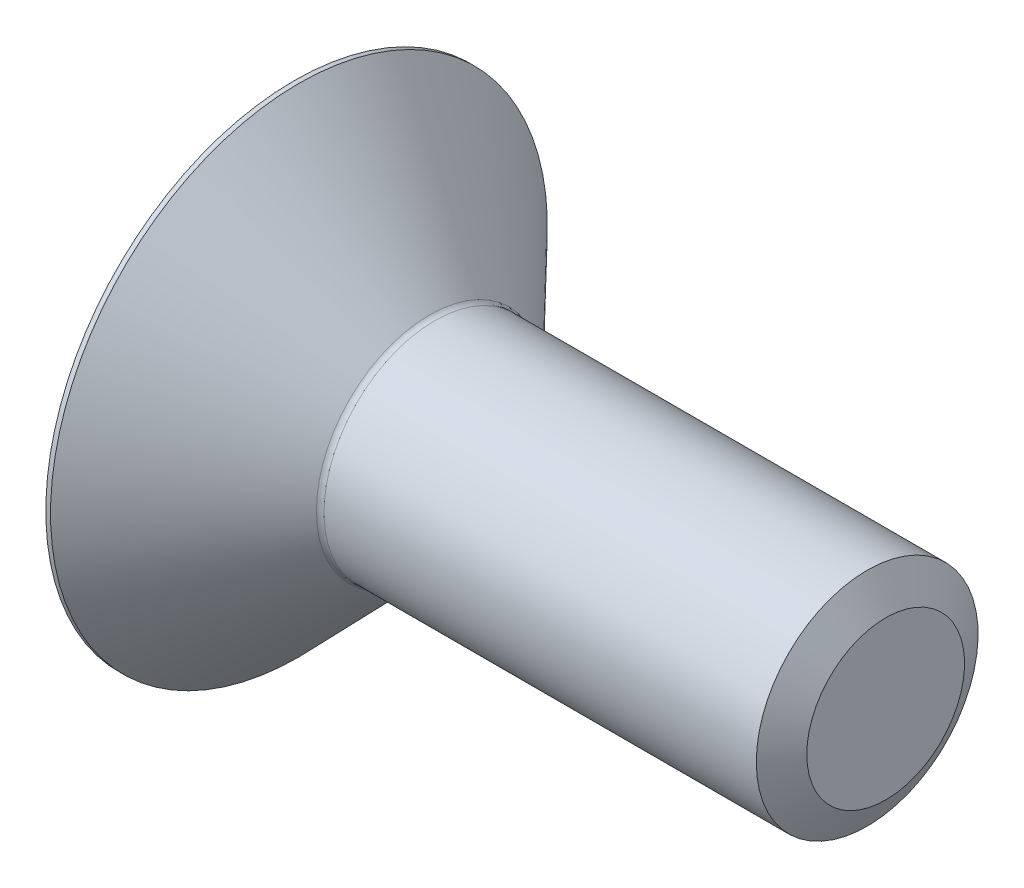
ISO-10303-21;
HEADER;
FILE_DESCRIPTION(('STEP AP214'),'2;1');
FILE_NAME('part.step','',(''),(''),'','','');
FILE_SCHEMA(('AUTOMOTIVE_DESIGN { 1 0 10303 214 1 1 1 1 }'));
ENDSEC;
DATA;
#1=APPLICATION_CONTEXT('core data for automotive mechanical design processes');
#2=APPLICATION_PROTOCOL_DEFINITION('international standard','automotive_design',2000,#1);
#3=PRODUCT_CONTEXT('',#1,'mechanical');
#4=PRODUCT('Part','Part','',(#3));
#5=PRODUCT_RELATED_PRODUCT_CATEGORY('part','',(#4));
#6=PRODUCT_DEFINITION_FORMATION('','',#4);
#7=PRODUCT_DEFINITION_CONTEXT('part definition',#1,'design');
#8=PRODUCT_DEFINITION('design','',#6,#7);
#9=PRODUCT_DEFINITION_SHAPE('','',#8);
#10=(LENGTH_UNIT() NAMED_UNIT(*) SI_UNIT(.MILLI.,.METRE.));
#11=(NAMED_UNIT(*) PLANE_ANGLE_UNIT() SI_UNIT($,.RADIAN.));
#12=(NAMED_UNIT(*) SI_UNIT($,.STERADIAN.) SOLID_ANGLE_UNIT());
#13=UNCERTAINTY_MEASURE_WITH_UNIT(LENGTH_MEASURE(1.E-05),#10,'distance_accuracy_value','');
#14=(GEOMETRIC_REPRESENTATION_CONTEXT(3) GLOBAL_UNCERTAINTY_ASSIGNED_CONTEXT((#13)) GLOBAL_UNIT_ASSIGNED_CONTEXT((#10,
#11,#12)) REPRESENTATION_CONTEXT('',''));
#15=CARTESIAN_POINT('',(0.,0.,0.));
#16=DIRECTION('',(0.,0.,1.));
#17=DIRECTION('',(1.,0.,0.));
#18=AXIS2_PLACEMENT_3D('',#15,#16,#17);
#19=CARTESIAN_POINT('',(0.,0.,0.));
#20=DIRECTION('',(1.,0.,0.));
#21=DIRECTION('',(0.,1.,0.));
#22=AXIS2_PLACEMENT_3D('',#19,#20,#21);
#23=CYLINDRICAL_SURFACE('',#22,1.5);
#24=CARTESIAN_POINT('',(-6.09755251837904,0.,0.));
#25=DIRECTION('',(1.,0.,0.));
#26=DIRECTION('',(0.,1.,0.));
#27=AXIS2_PLACEMENT_3D('',#24,#25,#26);
#28=CIRCLE('',#27,1.5);
#29=CARTESIAN_POINT('',(-6.09755251837904,1.5,0.));
#30=VERTEX_POINT('',#29);
#31=EDGE_CURVE('E123',#30,#30,#28,.T.);
#32=ORIENTED_EDGE('',*,*,#31,.T.);
#33=EDGE_LOOP('',(#32));
#34=FACE_BOUND('',#33,.T.);
#35=CARTESIAN_POINT('',(-0.25,0.,0.));
#36=DIRECTION('',(-1.,0.,0.));
#37=DIRECTION('',(0.,0.,1.));
#38=AXIS2_PLACEMENT_3D('',#35,#36,#37);
#39=CIRCLE('',#38,1.5);
#40=CARTESIAN_POINT('',(-0.25,0.,1.5));
#41=VERTEX_POINT('',#40);
#42=EDGE_CURVE('E114',#41,#41,#39,.T.);
#43=ORIENTED_EDGE('',*,*,#42,.T.);
#44=EDGE_LOOP('',(#43));
#45=FACE_BOUND('',#44,.T.);
#46=ADVANCED_FACE('F36',(#34,#45),#23,.T.);
#47=CARTESIAN_POINT('',(-8.,3.36,0.));
#48=DIRECTION('',(-1.,0.,0.));
#49=DIRECTION('',(0.,-1.,0.));
#50=AXIS2_PLACEMENT_3D('',#47,#48,#49);
#51=PLANE('',#50);
#52=CARTESIAN_POINT('',(-8.,0.,0.));
#53=DIRECTION('',(1.,0.,0.));
#54=DIRECTION('',(0.,1.,0.));
#55=AXIS2_PLACEMENT_3D('',#52,#53,#54);
#56=CIRCLE('',#55,3.36);
#57=CARTESIAN_POINT('',(-8.,3.36,0.));
#58=VERTEX_POINT('',#57);
#59=EDGE_CURVE('E206',#58,#58,#56,.T.);
#60=ORIENTED_EDGE('',*,*,#59,.F.);
#61=EDGE_LOOP('',(#60));
#62=FACE_BOUND('',#61,.T.);
#63=CARTESIAN_POINT('',(-8.,0.,0.));
#64=DIRECTION('',(-1.,0.,0.));
#65=DIRECTION('',(0.,-1.,0.));
#66=AXIS2_PLACEMENT_3D('',#63,#64,#65);
#67=CIRCLE('',#66,1.15470053837925);
#68=CARTESIAN_POINT('',(-8.,-0.577350269189631,0.999999999999996));
#69=VERTEX_POINT('',#68);
#70=CARTESIAN_POINT('',(-8.,-1.15470053837925,0.));
#71=VERTEX_POINT('',#70);
#72=EDGE_CURVE('E40',#69,#71,#67,.F.);
#73=ORIENTED_EDGE('',*,*,#72,.T.);
#74=CARTESIAN_POINT('',(-8.,-0.57735026918963,-0.999999999999997));
#75=VERTEX_POINT('',#74);
#76=EDGE_CURVE('E11',#71,#75,#67,.F.);
#77=ORIENTED_EDGE('',*,*,#76,.T.);
#78=CARTESIAN_POINT('',(-8.,0.577350269189625,-1.));
#79=VERTEX_POINT('',#78);
#80=EDGE_CURVE('E45',#75,#79,#67,.F.);
#81=ORIENTED_EDGE('',*,*,#80,.T.);
#82=CARTESIAN_POINT('',(-8.,1.15470053837925,0.));
#83=VERTEX_POINT('',#82);
#84=EDGE_CURVE('E110',#79,#83,#67,.F.);
#85=ORIENTED_EDGE('',*,*,#84,.T.);
#86=CARTESIAN_POINT('',(-8.,0.,0.));
#87=DIRECTION('',(-1.,0.,0.));
#88=DIRECTION('',(0.,0.,1.));
#89=AXIS2_PLACEMENT_3D('',#86,#87,#88);
#90=CIRCLE('',#89,1.15470053837925);
#91=CARTESIAN_POINT('',(-8.,0.577350269189629,0.999999999999997));
#92=VERTEX_POINT('',#91);
#93=EDGE_CURVE('E95',#92,#83,#90,.T.);
#94=ORIENTED_EDGE('',*,*,#93,.F.);
#95=EDGE_CURVE('E104',#92,#69,#67,.F.);
#96=ORIENTED_EDGE('',*,*,#95,.T.);
#97=EDGE_LOOP('',(#73,#77,#81,#85,#94,#96));
#98=FACE_BOUND('',#97,.T.);
#99=ADVANCED_FACE('F111',(#62,#98),#51,.T.);
#100=CARTESIAN_POINT('',(0.,0.,0.));
#101=DIRECTION('',(1.,0.,0.));
#102=DIRECTION('',(0.,1.,0.));
#103=AXIS2_PLACEMENT_3D('',#100,#101,#102);
#104=CYLINDRICAL_SURFACE('',#103,3.36);
#105=ORIENTED_EDGE('',*,*,#59,.T.);
#106=EDGE_LOOP('',(#105));
#107=FACE_BOUND('',#106,.T.);
#108=CARTESIAN_POINT('',(-7.93618112114115,0.,0.));
#109=DIRECTION('',(1.,0.,0.));
#110=DIRECTION('',(0.,1.,0.));
#111=AXIS2_PLACEMENT_3D('',#108,#109,#110);
#112=CIRCLE('',#111,3.36);
#113=CARTESIAN_POINT('',(-7.93618112114115,3.36,0.));
#114=VERTEX_POINT('',#113);
#115=EDGE_CURVE('E208',#114,#114,#112,.T.);
#116=ORIENTED_EDGE('',*,*,#115,.F.);
#117=EDGE_LOOP('',(#116));
#118=FACE_BOUND('',#117,.T.);
#119=ADVANCED_FACE('F196',(#107,#118),#104,.T.);
#120=CARTESIAN_POINT('',(-6.1694864984129,0.,0.));
#121=DIRECTION('',(-1.,0.,0.));
#122=DIRECTION('',(0.,-1.,0.));
#123=AXIS2_PLACEMENT_3D('',#120,#121,#122);
#124=CONICAL_SURFACE('',#123,1.5305341629541,0.802851455917393);
#125=ORIENTED_EDGE('',*,*,#115,.T.);
#126=EDGE_LOOP('',(#125));
#127=FACE_BOUND('',#126,.T.);
#128=CARTESIAN_POINT('',(-6.1694864984129,0.,0.));
#129=DIRECTION('',(1.,0.,0.));
#130=DIRECTION('',(0.,1.,0.));
#131=AXIS2_PLACEMENT_3D('',#128,#129,#130);
#132=CIRCLE('',#131,1.5305341629541);
#133=CARTESIAN_POINT('',(-6.1694864984129,1.5305341629541,0.));
#134=VERTEX_POINT('',#133);
#135=EDGE_CURVE('E212',#134,#134,#132,.T.);
#136=ORIENTED_EDGE('',*,*,#135,.F.);
#137=EDGE_LOOP('',(#136));
#138=FACE_BOUND('',#137,.T.);
#139=ADVANCED_FACE('F192',(#127,#138),#124,.T.);
#140=CARTESIAN_POINT('',(-6.09755251837904,0.,0.));
#141=DIRECTION('',(1.,0.,0.));
#142=DIRECTION('',(0.,1.,0.));
#143=AXIS2_PLACEMENT_3D('',#140,#141,#142);
#144=TOROIDAL_SURFACE('',#143,1.6,0.0999999999999999);
#145=ORIENTED_EDGE('',*,*,#135,.T.);
#146=EDGE_LOOP('',(#145));
#147=FACE_BOUND('',#146,.T.);
#148=ORIENTED_EDGE('',*,*,#31,.F.);
#149=EDGE_LOOP('',(#148));
#150=FACE_BOUND('',#149,.T.);
#151=ADVANCED_FACE('F188',(#147,#150),#144,.F.);
#152=CARTESIAN_POINT('',(-7.67,0.,0.));
#153=DIRECTION('',(-1.,0.,0.));
#154=DIRECTION('',(0.,0.,1.));
#155=AXIS2_PLACEMENT_3D('',#152,#153,#154);
#156=CONICAL_SURFACE('',#155,0.,1.2924281638629);
#157=CARTESIAN_POINT('',(-8.00003300494951,-0.577234799135789,1.0002));
#158=CARTESIAN_POINT('',(-7.99317677231321,-0.601209328784404,0.958674896561032));
#159=CARTESIAN_POINT('',(-7.986950249306,-0.625233209733957,0.917064314161421));
#160=CARTESIAN_POINT('',(-7.97600820198551,-0.673377505205147,0.83367594831071));
#161=CARTESIAN_POINT('',(-7.97129338172424,-0.697497959424798,0.791898096100636));
#162=CARTESIAN_POINT('',(-7.9636556441477,-0.745669161891495,0.70846312596663));
#163=CARTESIAN_POINT('',(-7.96072237456089,-0.769719488656233,0.66680673807147));
#164=CARTESIAN_POINT('',(-7.95678895886859,-0.817855017501818,0.58343355646172));
#165=CARTESIAN_POINT('',(-7.95578838324886,-0.841940210643129,0.54171677823086));
#166=CARTESIAN_POINT('',(-7.95578838324886,-0.890110596925751,0.458283221769139));
#167=CARTESIAN_POINT('',(-7.95678895886859,-0.914195790067062,0.416566443538279));
#168=CARTESIAN_POINT('',(-7.96072237456089,-0.962331318912646,0.333193261928529));
#169=CARTESIAN_POINT('',(-7.9636556441477,-0.986381645677384,0.29153687403337));
#170=CARTESIAN_POINT('',(-7.97129338172424,-1.03455284814408,0.208101903899363));
#171=CARTESIAN_POINT('',(-7.97600820198551,-1.05867330236373,0.166324051689289));
#172=CARTESIAN_POINT('',(-7.986950249306,-1.10681759783492,0.0829356858385784));
#173=CARTESIAN_POINT('',(-7.99317677231321,-1.13084147878448,0.0413251034389669));
#174=CARTESIAN_POINT('',(-8.00003300494951,-1.15481600843309,-0.000200000000000319));
#175=B_SPLINE_CURVE_WITH_KNOTS('',3,(#157,#158,#159,#160,#161,#162,#163,#164,#165,#166,#167,
#168,#169,#170,#171,#172,#173,#174),.UNSPECIFIED.,.F.,.F.,(4,2,2,2,2,2,2,2,4),(0.,
0.145319064827825,0.290705711767535,0.435239252261503,0.579740668498364,0.724242084735225,
0.868775625229193,1.0141622721689,1.15948133699673),.UNSPECIFIED.);
#176=EDGE_CURVE('E129',#69,#71,#175,.T.);
#177=ORIENTED_EDGE('',*,*,#176,.T.);
#178=ORIENTED_EDGE('',*,*,#72,.F.);
#179=EDGE_LOOP('',(#177,#178));
#180=FACE_BOUND('',#179,.T.);
#181=ADVANCED_FACE('F191',(#180),#156,.F.);
#182=CARTESIAN_POINT('',(-8.18642012479891,-1.50507658562174,1.));
#183=CARTESIAN_POINT('',(-8.17568053389836,-1.45995191683151,1.));
#184=CARTESIAN_POINT('',(-8.16507725550091,-1.41479478404147,1.));
#185=CARTESIAN_POINT('',(-8.14421246509078,-1.32439927872502,1.));
#186=CARTESIAN_POINT('',(-8.13395097066939,-1.27916090214299,1.));
#187=CARTESIAN_POINT('',(-8.10376110485824,-1.14320091952673,1.));
#188=CARTESIAN_POINT('',(-8.0844526928259,-1.0523395057026,1.));
#189=CARTESIAN_POINT('',(-8.0485427680109,-0.871021733651419,1.));
#190=CARTESIAN_POINT('',(-8.03191600726561,-0.780570478060274,1.));
#191=CARTESIAN_POINT('',(-8.00245938977244,-0.599053834032337,1.));
#192=CARTESIAN_POINT('',(-7.98962864404707,-0.507988594500085,1.));
#193=CARTESIAN_POINT('',(-7.96943375174607,-0.32401701013366,1.));
#194=CARTESIAN_POINT('',(-7.96214218519738,-0.231102062710143,1.));
#195=CARTESIAN_POINT('',(-7.95667782512395,-0.0915430747170626,1.));
#196=CARTESIAN_POINT('',(-7.9557682159605,-0.0450005144934817,1.));
#197=CARTESIAN_POINT('',(-7.95580922979905,0.048083890152762,1.));
#198=CARTESIAN_POINT('',(-7.9567598571057,0.0946257345735192,1.));
#199=CARTESIAN_POINT('',(-7.96235911230975,0.234573783926051,1.));
#200=CARTESIAN_POINT('',(-7.96977149970247,0.327875024932963,1.));
#201=CARTESIAN_POINT('',(-7.99036481799359,0.51386632785343,1.));
#202=CARTESIAN_POINT('',(-8.00355054731467,0.606555816131269,1.));
#203=CARTESIAN_POINT('',(-8.03433027338347,0.794559797027599,1.));
#204=CARTESIAN_POINT('',(-8.05206417336318,0.889850634542144,1.));
#205=CARTESIAN_POINT('',(-8.09017928884159,1.07990716554416,1.));
#206=CARTESIAN_POINT('',(-8.11056098996145,1.17467275936659,1.));
#207=CARTESIAN_POINT('',(-8.15303020702755,1.36384761434311,1.));
#208=CARTESIAN_POINT('',(-8.17511824931274,1.45825675605088,1.));
#209=CARTESIAN_POINT('',(-8.22042048843015,1.64680497415504,1.));
#210=CARTESIAN_POINT('',(-8.24363471263919,1.74094404392717,1.));
#211=CARTESIAN_POINT('',(-8.29049807328423,1.92768913293957,1.));
#212=CARTESIAN_POINT('',(-8.31413631318398,2.02029789764918,1.));
#213=CARTESIAN_POINT('',(-8.36194659114886,2.20537976707471,1.));
#214=CARTESIAN_POINT('',(-8.38611864310246,2.2978528681941,1.));
#215=CARTESIAN_POINT('',(-8.43481362957481,2.48255351818147,1.));
#216=CARTESIAN_POINT('',(-8.45933596375947,2.57478122564271,1.));
#217=CARTESIAN_POINT('',(-8.5086763218414,2.75915354563859,1.));
#218=CARTESIAN_POINT('',(-8.53349433367616,2.8512981613992,1.));
#219=CARTESIAN_POINT('',(-8.55841535287488,2.94341459729474,1.));
#220=B_SPLINE_CURVE_WITH_KNOTS('',3,(#182,#183,#184,#185,#186,#187,#188,#189,#190,#191,#192,
#193,#194,#195,#196,#197,#198,#199,#200,#201,#202,#203,#204,#205,#206,#207,#208,#209,#210,#211,
#212,#213,#214,#215,#216,#217,#218,#219),.UNSPECIFIED.,.F.,.F.,(4,2,2,2,2,2,2,2,2,2,2,2,2,2,2,2,
2,2,4),(0.,0.139154753232827,0.278316657587892,0.556964604480121,0.83281288176632,
1.10859650773445,1.38793420964474,1.52755398880046,1.66717409104072,1.94769382621527,
2.22844715485888,2.519169414303,2.80994506926728,3.10081077796332,3.39168356097394,
3.67841536084619,3.96515462957441,4.25145053495921,4.53773480030589),.UNSPECIFIED.);
#221=EDGE_CURVE('E100',#92,#69,#220,.F.);
#222=ORIENTED_EDGE('',*,*,#221,.T.);
#223=ORIENTED_EDGE('',*,*,#95,.F.);
#224=EDGE_LOOP('',(#222,#223));
#225=FACE_BOUND('',#224,.T.);
#226=ADVANCED_FACE('F105',(#225),#156,.F.);
#227=CARTESIAN_POINT('',(-8.0000330049495,1.15481600843309,-0.000199999999999794));
#228=CARTESIAN_POINT('',(-7.99317677231321,1.13084147878447,0.0413251034389675));
#229=CARTESIAN_POINT('',(-7.986950249306,1.10681759783492,0.0829356858385789));
#230=CARTESIAN_POINT('',(-7.97600820198551,1.05867330236373,0.166324051689289));
#231=CARTESIAN_POINT('',(-7.97129338172424,1.03455284814408,0.208101903899364));
#232=CARTESIAN_POINT('',(-7.9636556441477,0.986381645677383,0.29153687403337));
#233=CARTESIAN_POINT('',(-7.96072237456089,0.962331318912645,0.33319326192853));
#234=CARTESIAN_POINT('',(-7.95678895886859,0.91419579006706,0.416566443538279));
#235=CARTESIAN_POINT('',(-7.95578838324886,0.890110596925749,0.458283221769139));
#236=CARTESIAN_POINT('',(-7.95578838324886,0.841940210643127,0.54171677823086));
#237=CARTESIAN_POINT('',(-7.95678895886859,0.817855017501816,0.58343355646172));
#238=CARTESIAN_POINT('',(-7.96072237456089,0.769719488656231,0.66680673807147));
#239=CARTESIAN_POINT('',(-7.9636556441477,0.745669161891493,0.70846312596663));
#240=CARTESIAN_POINT('',(-7.97129338172424,0.697497959424797,0.791898096100636));
#241=CARTESIAN_POINT('',(-7.97600820198551,0.673377505205146,0.83367594831071));
#242=CARTESIAN_POINT('',(-7.986950249306,0.625233209733955,0.917064314161421));
#243=CARTESIAN_POINT('',(-7.99317677231321,0.601209328784402,0.958674896561032));
#244=CARTESIAN_POINT('',(-8.0000330049495,0.577234799135788,1.0002));
#245=B_SPLINE_CURVE_WITH_KNOTS('',3,(#227,#228,#229,#230,#231,#232,#233,#234,#235,#236,#237,
#238,#239,#240,#241,#242,#243,#244),.UNSPECIFIED.,.F.,.F.,(4,2,2,2,2,2,2,2,4),(0.,
0.145319064827825,0.290705711767534,0.435239252261502,0.579740668498363,0.724242084735224,
0.868775625229192,1.0141622721689,1.15948133699673),.UNSPECIFIED.);
#246=EDGE_CURVE('E91',#83,#92,#245,.T.);
#247=ORIENTED_EDGE('',*,*,#246,.T.);
#248=ORIENTED_EDGE('',*,*,#93,.T.);
#249=EDGE_LOOP('',(#247,#248));
#250=FACE_BOUND('',#249,.T.);
#251=ADVANCED_FACE('F93',(#250),#156,.F.);
#252=CARTESIAN_POINT('',(-8.00003300494951,0.577234799135787,-1.0002));
#253=CARTESIAN_POINT('',(-7.99317677231321,0.601209328784402,-0.958674896561033));
#254=CARTESIAN_POINT('',(-7.986950249306,0.625233209733955,-0.917064314161421));
#255=CARTESIAN_POINT('',(-7.97600820198551,0.673377505205145,-0.833675948310711));
#256=CARTESIAN_POINT('',(-7.97129338172424,0.697497959424796,-0.791898096100636));
#257=CARTESIAN_POINT('',(-7.9636556441477,0.745669161891493,-0.70846312596663));
#258=CARTESIAN_POINT('',(-7.96072237456089,0.769719488656231,-0.66680673807147));
#259=CARTESIAN_POINT('',(-7.95678895886859,0.817855017501816,-0.583433556461721));
#260=CARTESIAN_POINT('',(-7.95578838324886,0.841940210643127,-0.54171677823086));
#261=CARTESIAN_POINT('',(-7.95578838324886,0.890110596925749,-0.458283221769139));
#262=CARTESIAN_POINT('',(-7.95678895886859,0.91419579006706,-0.416566443538279));
#263=CARTESIAN_POINT('',(-7.96072237456089,0.962331318912645,-0.33319326192853));
#264=CARTESIAN_POINT('',(-7.9636556441477,0.986381645677383,-0.29153687403337));
#265=CARTESIAN_POINT('',(-7.97129338172424,1.03455284814408,-0.208101903899364));
#266=CARTESIAN_POINT('',(-7.97600820198551,1.05867330236373,-0.166324051689289));
#267=CARTESIAN_POINT('',(-7.986950249306,1.10681759783492,-0.0829356858385788));
#268=CARTESIAN_POINT('',(-7.99317677231321,1.13084147878447,-0.0413251034389674));
#269=CARTESIAN_POINT('',(-8.0000330049495,1.15481600843309,0.000200000000000013));
#270=B_SPLINE_CURVE_WITH_KNOTS('',3,(#252,#253,#254,#255,#256,#257,#258,#259,#260,#261,#262,
#263,#264,#265,#266,#267,#268,#269),.UNSPECIFIED.,.F.,.F.,(4,2,2,2,2,2,2,2,4),(0.,
0.145319064827825,0.290705711767534,0.435239252261502,0.579740668498364,0.724242084735225,
0.868775625229193,1.0141622721689,1.15948133699673),.UNSPECIFIED.);
#271=EDGE_CURVE('E113',#79,#83,#270,.T.);
#272=ORIENTED_EDGE('',*,*,#271,.T.);
#273=ORIENTED_EDGE('',*,*,#84,.F.);
#274=EDGE_LOOP('',(#272,#273));
#275=FACE_BOUND('',#274,.T.);
#276=ADVANCED_FACE('F282',(#275),#156,.F.);
#277=CARTESIAN_POINT('',(-8.18642012479891,-1.50507658562174,-1.));
#278=CARTESIAN_POINT('',(-8.17568053389836,-1.45995191683151,-1.));
#279=CARTESIAN_POINT('',(-8.16507725550091,-1.41479478404147,-1.));
#280=CARTESIAN_POINT('',(-8.14421246509078,-1.32439927872502,-1.));
#281=CARTESIAN_POINT('',(-8.13395097066939,-1.27916090214299,-1.));
#282=CARTESIAN_POINT('',(-8.10376110485824,-1.14320091952673,-1.));
#283=CARTESIAN_POINT('',(-8.0844526928259,-1.0523395057026,-1.));
#284=CARTESIAN_POINT('',(-8.0485427680109,-0.871021733651419,-1.));
#285=CARTESIAN_POINT('',(-8.03191600726561,-0.780570478060274,-1.));
#286=CARTESIAN_POINT('',(-8.00245938977244,-0.599053834032336,-1.));
#287=CARTESIAN_POINT('',(-7.98962864404707,-0.507988594500085,-1.));
#288=CARTESIAN_POINT('',(-7.96943375174607,-0.32401701013366,-1.));
#289=CARTESIAN_POINT('',(-7.96214218519738,-0.231102062710143,-1.));
#290=CARTESIAN_POINT('',(-7.95667782512395,-0.0915430747170623,-1.));
#291=CARTESIAN_POINT('',(-7.9557682159605,-0.0450005144934814,-1.));
#292=CARTESIAN_POINT('',(-7.95580922979905,0.0480838901527623,-1.));
#293=CARTESIAN_POINT('',(-7.9567598571057,0.0946257345735195,-1.));
#294=CARTESIAN_POINT('',(-7.96235911230975,0.234573783926051,-1.));
#295=CARTESIAN_POINT('',(-7.96977149970247,0.327875024932963,-1.));
#296=CARTESIAN_POINT('',(-7.99036481799359,0.513866327853431,-1.));
#297=CARTESIAN_POINT('',(-8.00355054731467,0.60655581613127,-1.));
#298=CARTESIAN_POINT('',(-8.03433027338347,0.794559797027599,-1.));
#299=CARTESIAN_POINT('',(-8.05206417336318,0.889850634542144,-1.));
#300=CARTESIAN_POINT('',(-8.09017928884159,1.07990716554416,-1.));
#301=CARTESIAN_POINT('',(-8.11056098996145,1.17467275936659,-1.));
#302=CARTESIAN_POINT('',(-8.15303020702755,1.36384761434311,-1.));
#303=CARTESIAN_POINT('',(-8.17511824931274,1.45825675605088,-1.));
#304=CARTESIAN_POINT('',(-8.22042048843015,1.64680497415504,-1.));
#305=CARTESIAN_POINT('',(-8.24363471263919,1.74094404392717,-1.));
#306=CARTESIAN_POINT('',(-8.29049807328423,1.92768913293957,-1.));
#307=CARTESIAN_POINT('',(-8.31413631318398,2.02029789764918,-1.));
#308=CARTESIAN_POINT('',(-8.36194659114886,2.20537976707471,-1.));
#309=CARTESIAN_POINT('',(-8.38611864310246,2.2978528681941,-1.));
#310=CARTESIAN_POINT('',(-8.43481362957481,2.48255351818147,-1.));
#311=CARTESIAN_POINT('',(-8.45933596375947,2.57478122564271,-1.));
#312=CARTESIAN_POINT('',(-8.5086763218414,2.75915354563859,-1.));
#313=CARTESIAN_POINT('',(-8.53349433367616,2.8512981613992,-1.));
#314=CARTESIAN_POINT('',(-8.55841535287488,2.94341459729474,-1.));
#315=B_SPLINE_CURVE_WITH_KNOTS('',3,(#277,#278,#279,#280,#281,#282,#283,#284,#285,#286,#287,
#288,#289,#290,#291,#292,#293,#294,#295,#296,#297,#298,#299,#300,#301,#302,#303,#304,#305,#306,
#307,#308,#309,#310,#311,#312,#313,#314),.UNSPECIFIED.,.F.,.F.,(4,2,2,2,2,2,2,2,2,2,2,2,2,2,2,2,
2,2,4),(0.,0.139154753232827,0.278316657587892,0.556964604480121,0.83281288176632,
1.10859650773445,1.38793420964474,1.52755398880046,1.66717409104072,1.94769382621527,
2.22844715485888,2.519169414303,2.80994506926728,3.10081077796332,3.39168356097394,
3.67841536084619,3.96515462957441,4.25145053495921,4.53773480030589),.UNSPECIFIED.);
#316=EDGE_CURVE('E241',#75,#79,#315,.T.);
#317=ORIENTED_EDGE('',*,*,#316,.T.);
#318=ORIENTED_EDGE('',*,*,#80,.F.);
#319=EDGE_LOOP('',(#317,#318));
#320=FACE_BOUND('',#319,.T.);
#321=ADVANCED_FACE('F269',(#320),#156,.F.);
#322=CARTESIAN_POINT('',(-8.00003300494951,-1.15481600843309,0.000199999999999856));
#323=CARTESIAN_POINT('',(-7.99317677231321,-1.13084147878448,-0.0413251034389674));
#324=CARTESIAN_POINT('',(-7.986950249306,-1.10681759783492,-0.0829356858385789));
#325=CARTESIAN_POINT('',(-7.97600820198551,-1.05867330236373,-0.16632405168929));
#326=CARTESIAN_POINT('',(-7.97129338172424,-1.03455284814408,-0.208101903899364));
#327=CARTESIAN_POINT('',(-7.9636556441477,-0.986381645677385,-0.29153687403337));
#328=CARTESIAN_POINT('',(-7.96072237456089,-0.962331318912646,-0.33319326192853));
#329=CARTESIAN_POINT('',(-7.95678895886859,-0.914195790067062,-0.416566443538279));
#330=CARTESIAN_POINT('',(-7.95578838324886,-0.890110596925751,-0.45828322176914));
#331=CARTESIAN_POINT('',(-7.95578838324886,-0.841940210643129,-0.54171677823086));
#332=CARTESIAN_POINT('',(-7.95678895886859,-0.817855017501818,-0.58343355646172));
#333=CARTESIAN_POINT('',(-7.96072237456089,-0.769719488656233,-0.66680673807147));
#334=CARTESIAN_POINT('',(-7.9636556441477,-0.745669161891495,-0.70846312596663));
#335=CARTESIAN_POINT('',(-7.97129338172424,-0.697497959424798,-0.791898096100636));
#336=CARTESIAN_POINT('',(-7.97600820198551,-0.673377505205147,-0.83367594831071));
#337=CARTESIAN_POINT('',(-7.986950249306,-0.625233209733956,-0.917064314161421));
#338=CARTESIAN_POINT('',(-7.99317677231321,-0.601209328784404,-0.958674896561032));
#339=CARTESIAN_POINT('',(-8.00003300494951,-0.577234799135789,-1.0002));
#340=B_SPLINE_CURVE_WITH_KNOTS('',3,(#322,#323,#324,#325,#326,#327,#328,#329,#330,#331,#332,
#333,#334,#335,#336,#337,#338,#339),.UNSPECIFIED.,.F.,.F.,(4,2,2,2,2,2,2,2,4),(0.,
0.145319064827825,0.290705711767534,0.435239252261502,0.579740668498364,0.724242084735225,
0.868775625229193,1.0141622721689,1.15948133699673),.UNSPECIFIED.);
#341=EDGE_CURVE('E131',#71,#75,#340,.T.);
#342=ORIENTED_EDGE('',*,*,#341,.T.);
#343=ORIENTED_EDGE('',*,*,#76,.F.);
#344=EDGE_LOOP('',(#342,#343));
#345=FACE_BOUND('',#344,.T.);
#346=ADVANCED_FACE('F272',(#345),#156,.F.);
#347=CARTESIAN_POINT('',(-6.9,0.,0.));
#348=DIRECTION('',(-1.,0.,0.));
#349=DIRECTION('',(0.,0.,1.));
#350=AXIS2_PLACEMENT_3D('',#347,#348,#349);
#351=CONICAL_SURFACE('',#350,1.15470053837925,1.0471975511966);
#352=CARTESIAN_POINT('',(-6.23333333333334,0.,0.));
#353=VERTEX_POINT('',#352);
#354=VERTEX_LOOP('',#353);
#355=FACE_BOUND('',#354,.T.);
#356=CARTESIAN_POINT('',(-7.27183528873947,-1.49514512143374,1.));
#357=CARTESIAN_POINT('',(-7.25111502079343,-1.4519612611533,1.));
#358=CARTESIAN_POINT('',(-7.23061367234947,-1.40867282404236,1.));
#359=CARTESIAN_POINT('',(-7.1901634335246,-1.32182947914248,1.));
#360=CARTESIAN_POINT('',(-7.17021464256729,-1.27827452509756,1.));
#361=CARTESIAN_POINT('',(-7.11114515483648,-1.14662339890625,1.));
#362=CARTESIAN_POINT('',(-7.07305252653304,-1.05805724149108,1.));
#363=CARTESIAN_POINT('',(-7.00024582070057,-0.876833003172497,1.));
#364=CARTESIAN_POINT('',(-6.96564584045392,-0.784128452056495,1.));
#365=CARTESIAN_POINT('',(-6.90407347381845,-0.596331746532131,1.));
#366=CARTESIAN_POINT('',(-6.87708128484786,-0.501246505541257,1.));
#367=CARTESIAN_POINT('',(-6.84577577003502,-0.356699986452703,1.));
#368=CARTESIAN_POINT('',(-6.83687509854699,-0.30824416317171,1.));
#369=CARTESIAN_POINT('',(-6.82274243175691,-0.210788870695443,1.));
#370=CARTESIAN_POINT('',(-6.81751018853518,-0.161789438465742,1.));
#371=CARTESIAN_POINT('',(-6.81119898098177,-0.064106048997066,1.));
#372=CARTESIAN_POINT('',(-6.81007100501111,-0.0154253461269769,1.));
#373=CARTESIAN_POINT('',(-6.81193297830514,0.0818553564032755,1.));
#374=CARTESIAN_POINT('',(-6.81492318255361,0.130455350879702,1.));
#375=CARTESIAN_POINT('',(-6.8271183217293,0.250369589613778,1.));
#376=CARTESIAN_POINT('',(-6.83860856098489,0.321451919115027,1.));
#377=CARTESIAN_POINT('',(-6.86824031739763,0.462229038490168,1.));
#378=CARTESIAN_POINT('',(-6.88638985094493,0.531922048861732,1.));
#379=CARTESIAN_POINT('',(-6.92786972268665,0.671415729806805,1.));
#380=CARTESIAN_POINT('',(-6.95130716830693,0.74118372941807,1.));
#381=CARTESIAN_POINT('',(-7.00156448824641,0.879438319396288,1.));
#382=CARTESIAN_POINT('',(-7.02838317523047,0.94792534993256,1.));
#383=CARTESIAN_POINT('',(-7.10005391547339,1.12214515906645,1.));
#384=CARTESIAN_POINT('',(-7.14657230519898,1.22718574040678,1.));
#385=CARTESIAN_POINT('',(-7.24287692224798,1.43575968104558,1.));
#386=CARTESIAN_POINT('',(-7.29266398782224,1.53929264533347,1.));
#387=CARTESIAN_POINT('',(-7.39433644453464,1.74546702338822,1.));
#388=CARTESIAN_POINT('',(-7.44622418186697,1.84810727553999,1.));
#389=CARTESIAN_POINT('',(-7.55133836883522,2.05270058021726,1.));
#390=CARTESIAN_POINT('',(-7.60456486267233,2.15465360991172,1.));
#391=CARTESIAN_POINT('',(-7.7068669169112,2.34846553091283,1.));
#392=CARTESIAN_POINT('',(-7.75585965896403,2.44036823161571,1.));
#393=CARTESIAN_POINT('',(-7.85440313282821,2.623877990053,1.));
#394=CARTESIAN_POINT('',(-7.90395388528948,2.71548503668387,1.));
#395=CARTESIAN_POINT('',(-8.00334710767982,2.89823865557593,1.));
#396=CARTESIAN_POINT('',(-8.05318851504101,2.98938580641155,1.));
#397=CARTESIAN_POINT('',(-8.15319572337612,3.17149583112621,1.));
#398=CARTESIAN_POINT('',(-8.20336150723714,3.26245871439934,1.));
#399=CARTESIAN_POINT('',(-8.25364621220496,3.35335539208175,1.));
#400=B_SPLINE_CURVE_WITH_KNOTS('',3,(#356,#357,#358,#359,#360,#361,#362,#363,#364,#365,#366,
#367,#368,#369,#370,#371,#372,#373,#374,#375,#376,#377,#378,#379,#380,#381,#382,#383,#384,#385,
#386,#387,#388,#389,#390,#391,#392,#393,#394,#395,#396,#397,#398,#399),.UNSPECIFIED.,.F.,.F.,(4,
2,2,2,2,2,2,2,2,2,2,2,2,2,2,2,2,2,2,2,2,4),(0.,0.14369034182065,0.287406372566272,
0.576560332877491,0.87325948893403,1.16917907000006,1.31686338831957,1.46453772487642,
1.61044269221659,1.75635669390452,1.97192533331897,2.18775432802313,2.40842600301165,
2.62902040304935,2.97355048126458,3.31816926186283,3.6631841739513,4.00821049225242,
4.32064609598596,4.63309330006987,4.9447457824876,5.2563819552864),.UNSPECIFIED.);
#401=CARTESIAN_POINT('',(-6.9,-0.577350269189627,1.));
#402=VERTEX_POINT('',#401);
#403=CARTESIAN_POINT('',(-6.9,0.577350269189625,1.));
#404=VERTEX_POINT('',#403);
#405=EDGE_CURVE('E160',#402,#404,#400,.T.);
#406=ORIENTED_EDGE('',*,*,#405,.T.);
#407=CARTESIAN_POINT('',(-6.90006667666567,0.577234799135787,1.0002));
#408=CARTESIAN_POINT('',(-6.88540897364915,0.602607795820547,0.95625268060172));
#409=CARTESIAN_POINT('',(-6.8720777236209,0.628199807531657,0.911926016050179));
#410=CARTESIAN_POINT('',(-6.84880650762345,0.67982709833083,0.822504925328878));
#411=CARTESIAN_POINT('',(-6.83887477654978,0.705863295614157,0.777408908798269));
#412=CARTESIAN_POINT('',(-6.82341269488208,0.757612978088367,0.687775829477381));
#413=CARTESIAN_POINT('',(-6.81777946809895,0.783318495222182,0.643252567766781));
#414=CARTESIAN_POINT('',(-6.81105128864025,0.83485064837367,0.553996260284983));
#415=CARTESIAN_POINT('',(-6.80995076792166,0.86067709674978,0.509263539518505));
#416=CARTESIAN_POINT('',(-6.81222505229814,0.908946264126689,0.425658889182653));
#417=CARTESIAN_POINT('',(-6.81504143886341,0.931396163287556,0.386774523211233));
#418=CARTESIAN_POINT('',(-6.82397245021735,0.976149681982092,0.309259155014813));
#419=CARTESIAN_POINT('',(-6.8300901337543,0.99845314641145,0.270628421438361));
#420=CARTESIAN_POINT('',(-6.84538572572582,1.04329913914046,0.192952883515855));
#421=CARTESIAN_POINT('',(-6.85462855216896,1.0658359836813,0.153917923728832));
#422=CARTESIAN_POINT('',(-6.87560684575553,1.11057330008463,0.0764306187239879));
#423=CARTESIAN_POINT('',(-6.88733737513366,1.13277434629517,0.0379772787061408));
#424=CARTESIAN_POINT('',(-6.90006667666567,1.15481600843309,-0.000199999999999794));
#425=B_SPLINE_CURVE_WITH_KNOTS('',3,(#407,#408,#409,#410,#411,#412,#413,#414,#415,#416,#417,
#418,#419,#420,#421,#422,#423,#424),.UNSPECIFIED.,.F.,.F.,(4,2,2,2,2,2,2,2,4),(0.,
0.158523820030115,0.317428970089342,0.472400167924633,0.627180939971648,0.762016584872711,
0.896977373984233,1.03493410168667,1.17261952416172),.UNSPECIFIED.);
#426=CARTESIAN_POINT('',(-6.9,1.15470053837925,0.));
#427=VERTEX_POINT('',#426);
#428=EDGE_CURVE('E120',#404,#427,#425,.T.);
#429=ORIENTED_EDGE('',*,*,#428,.T.);
#430=CARTESIAN_POINT('',(-6.90006667666567,1.15481600843309,0.000200000000000205));
#431=CARTESIAN_POINT('',(-6.88540897364915,1.12944301174833,-0.0437473193982798));
#432=CARTESIAN_POINT('',(-6.8720777236209,1.10385100003722,-0.0880739839498201));
#433=CARTESIAN_POINT('',(-6.84880650762345,1.05222370923805,-0.177495074671122));
#434=CARTESIAN_POINT('',(-6.83887477654978,1.02618751195472,-0.222591091201731));
#435=CARTESIAN_POINT('',(-6.82341269488208,0.974437829480509,-0.312224170522618));
#436=CARTESIAN_POINT('',(-6.81777946809895,0.948732312346694,-0.356747432233219));
#437=CARTESIAN_POINT('',(-6.81105128864025,0.897200159195206,-0.446003739715017));
#438=CARTESIAN_POINT('',(-6.80995076792166,0.871373710819096,-0.490736460481494));
#439=CARTESIAN_POINT('',(-6.81222505229814,0.823104543442187,-0.574341110817346));
#440=CARTESIAN_POINT('',(-6.81504143886341,0.80065464428132,-0.613225476788766));
#441=CARTESIAN_POINT('',(-6.82397245021735,0.755901125586784,-0.690740844985186));
#442=CARTESIAN_POINT('',(-6.8300901337543,0.733597661157426,-0.729371578561639));
#443=CARTESIAN_POINT('',(-6.84538572572582,0.688751668428419,-0.807047116484145));
#444=CARTESIAN_POINT('',(-6.85462855216896,0.666214823887575,-0.846082076271167));
#445=CARTESIAN_POINT('',(-6.87560684575553,0.621477507484249,-0.923569381276012));
#446=CARTESIAN_POINT('',(-6.88733737513366,0.599276461273705,-0.962022721293859));
#447=CARTESIAN_POINT('',(-6.90006667666567,0.577234799135787,-1.0002));
#448=B_SPLINE_CURVE_WITH_KNOTS('',3,(#430,#431,#432,#433,#434,#435,#436,#437,#438,#439,#440,
#441,#442,#443,#444,#445,#446,#447),.UNSPECIFIED.,.F.,.F.,(4,2,2,2,2,2,2,2,4),(0.,
0.158523820030115,0.317428970089342,0.472400167924633,0.627180939971648,0.762016584872711,
0.896977373984233,1.03493410168667,1.17261952416172),.UNSPECIFIED.);
#449=CARTESIAN_POINT('',(-6.9,0.577350269189626,-0.999999999999999));
#450=VERTEX_POINT('',#449);
#451=EDGE_CURVE('E207',#427,#450,#448,.T.);
#452=ORIENTED_EDGE('',*,*,#451,.T.);
#453=CARTESIAN_POINT('',(-7.27183528873947,-1.49514512143373,-1.));
#454=CARTESIAN_POINT('',(-7.25111502079343,-1.4519612611533,-1.));
#455=CARTESIAN_POINT('',(-7.23061367234947,-1.40867282404236,-1.));
#456=CARTESIAN_POINT('',(-7.1901634335246,-1.32182947914247,-1.));
#457=CARTESIAN_POINT('',(-7.17021464256729,-1.27827452509756,-1.));
#458=CARTESIAN_POINT('',(-7.11114515483648,-1.14662339890625,-1.));
#459=CARTESIAN_POINT('',(-7.07305252653304,-1.05805724149108,-1.));
#460=CARTESIAN_POINT('',(-7.00024582070057,-0.876833003172495,-1.));
#461=CARTESIAN_POINT('',(-6.96564584045392,-0.784128452056494,-1.));
#462=CARTESIAN_POINT('',(-6.90407347381845,-0.59633174653213,-1.));
#463=CARTESIAN_POINT('',(-6.87708128484786,-0.501246505541256,-1.));
#464=CARTESIAN_POINT('',(-6.84577577003502,-0.356699986452703,-1.));
#465=CARTESIAN_POINT('',(-6.83687509854699,-0.308244163171709,-1.));
#466=CARTESIAN_POINT('',(-6.82274243175691,-0.210788870695442,-1.));
#467=CARTESIAN_POINT('',(-6.81751018853518,-0.161789438465742,-1.));
#468=CARTESIAN_POINT('',(-6.81119898098177,-0.064106048997066,-1.));
#469=CARTESIAN_POINT('',(-6.81007100501111,-0.0154253461269769,-1.));
#470=CARTESIAN_POINT('',(-6.81193297830514,0.0818553564032754,-1.));
#471=CARTESIAN_POINT('',(-6.81492318255361,0.130455350879702,-1.));
#472=CARTESIAN_POINT('',(-6.8271183217293,0.250369589613778,-1.));
#473=CARTESIAN_POINT('',(-6.83860856098489,0.321451919115028,-1.));
#474=CARTESIAN_POINT('',(-6.86824031739763,0.462229038490168,-1.));
#475=CARTESIAN_POINT('',(-6.88638985094493,0.531922048861733,-1.));
#476=CARTESIAN_POINT('',(-6.92786972268665,0.671415729806806,-1.));
#477=CARTESIAN_POINT('',(-6.95130716830693,0.741183729418071,-1.));
#478=CARTESIAN_POINT('',(-7.00156448824641,0.879438319396288,-1.));
#479=CARTESIAN_POINT('',(-7.02838317523047,0.94792534993256,-1.));
#480=CARTESIAN_POINT('',(-7.1000539154734,1.12214515906645,-1.));
#481=CARTESIAN_POINT('',(-7.14657230519898,1.22718574040678,-1.));
#482=CARTESIAN_POINT('',(-7.24287692224798,1.43575968104558,-1.));
#483=CARTESIAN_POINT('',(-7.29266398782224,1.53929264533347,-1.));
#484=CARTESIAN_POINT('',(-7.39433644453464,1.74546702338822,-1.));
#485=CARTESIAN_POINT('',(-7.44622418186697,1.84810727553999,-1.));
#486=CARTESIAN_POINT('',(-7.55133836883522,2.05270058021726,-1.));
#487=CARTESIAN_POINT('',(-7.60456486267233,2.15465360991172,-1.));
#488=CARTESIAN_POINT('',(-7.7068669169112,2.34846553091283,-1.));
#489=CARTESIAN_POINT('',(-7.75585965896403,2.44036823161571,-1.));
#490=CARTESIAN_POINT('',(-7.85440313282821,2.623877990053,-1.));
#491=CARTESIAN_POINT('',(-7.90395388528948,2.71548503668387,-1.));
#492=CARTESIAN_POINT('',(-8.00334710767982,2.89823865557593,-1.));
#493=CARTESIAN_POINT('',(-8.05318851504101,2.98938580641155,-1.));
#494=CARTESIAN_POINT('',(-8.15319572337612,3.17149583112621,-1.));
#495=CARTESIAN_POINT('',(-8.20336150723714,3.26245871439934,-1.));
#496=CARTESIAN_POINT('',(-8.25364621220496,3.35335539208175,-1.));
#497=B_SPLINE_CURVE_WITH_KNOTS('',3,(#453,#454,#455,#456,#457,#458,#459,#460,#461,#462,#463,
#464,#465,#466,#467,#468,#469,#470,#471,#472,#473,#474,#475,#476,#477,#478,#479,#480,#481,#482,
#483,#484,#485,#486,#487,#488,#489,#490,#491,#492,#493,#494,#495,#496),.UNSPECIFIED.,.F.,.F.,(4,
2,2,2,2,2,2,2,2,2,2,2,2,2,2,2,2,2,2,2,2,4),(0.,0.143690341820649,0.287406372566272,
0.57656033287749,0.873259488934029,1.16917907000006,1.31686338831957,1.46453772487642,
1.61044269221658,1.75635669390451,1.97192533331897,2.18775432802313,2.40842600301165,
2.62902040304935,2.97355048126458,3.31816926186283,3.6631841739513,4.00821049225242,
4.32064609598596,4.63309330006987,4.9447457824876,5.2563819552864),.UNSPECIFIED.);
#498=CARTESIAN_POINT('',(-6.9,-0.577350269189626,-1.));
#499=VERTEX_POINT('',#498);
#500=EDGE_CURVE('E99',#450,#499,#497,.F.);
#501=ORIENTED_EDGE('',*,*,#500,.T.);
#502=CARTESIAN_POINT('',(-6.90006667666567,-0.577234799135789,-1.0002));
#503=CARTESIAN_POINT('',(-6.88540897364915,-0.602607795820548,-0.95625268060172));
#504=CARTESIAN_POINT('',(-6.87207772362089,-0.628199807531658,-0.91192601605018));
#505=CARTESIAN_POINT('',(-6.84880650762345,-0.679827098330832,-0.822504925328878));
#506=CARTESIAN_POINT('',(-6.83887477654978,-0.705863295614159,-0.777408908798269));
#507=CARTESIAN_POINT('',(-6.82341269488208,-0.757612978088368,-0.687775829477381));
#508=CARTESIAN_POINT('',(-6.81777946809895,-0.783318495222184,-0.643252567766781));
#509=CARTESIAN_POINT('',(-6.81105128864025,-0.834850648373672,-0.553996260284983));
#510=CARTESIAN_POINT('',(-6.80995076792166,-0.860677096749782,-0.509263539518505));
#511=CARTESIAN_POINT('',(-6.81222505229814,-0.90894626412669,-0.425658889182653));
#512=CARTESIAN_POINT('',(-6.81504143886341,-0.931396163287558,-0.386774523211234));
#513=CARTESIAN_POINT('',(-6.82397245021735,-0.976149681982094,-0.309259155014814));
#514=CARTESIAN_POINT('',(-6.8300901337543,-0.998453146411451,-0.270628421438361));
#515=CARTESIAN_POINT('',(-6.84538572572582,-1.04329913914046,-0.192952883515855));
#516=CARTESIAN_POINT('',(-6.85462855216896,-1.0658359836813,-0.153917923728832));
#517=CARTESIAN_POINT('',(-6.87560684575553,-1.11057330008463,-0.0764306187239879));
#518=CARTESIAN_POINT('',(-6.88733737513366,-1.13277434629517,-0.0379772787061409));
#519=CARTESIAN_POINT('',(-6.90006667666567,-1.15481600843309,0.00019999999999978));
#520=B_SPLINE_CURVE_WITH_KNOTS('',3,(#502,#503,#504,#505,#506,#507,#508,#509,#510,#511,#512,
#513,#514,#515,#516,#517,#518,#519),.UNSPECIFIED.,.F.,.F.,(4,2,2,2,2,2,2,2,4),(0.,
0.158523820030116,0.317428970089342,0.472400167924633,0.627180939971648,0.762016584872711,
0.896977373984233,1.03493410168667,1.17261952416172),.UNSPECIFIED.);
#521=CARTESIAN_POINT('',(-6.9,-1.15470053837925,0.));
#522=VERTEX_POINT('',#521);
#523=EDGE_CURVE('E256',#499,#522,#520,.T.);
#524=ORIENTED_EDGE('',*,*,#523,.T.);
#525=CARTESIAN_POINT('',(-6.90006667666567,-1.15481600843309,-0.000200000000000144));
#526=CARTESIAN_POINT('',(-6.88540897364915,-1.12944301174833,0.0437473193982799));
#527=CARTESIAN_POINT('',(-6.8720777236209,-1.10385100003722,0.0880739839498204));
#528=CARTESIAN_POINT('',(-6.84880650762346,-1.05222370923805,0.177495074671122));
#529=CARTESIAN_POINT('',(-6.83887477654978,-1.02618751195472,0.222591091201731));
#530=CARTESIAN_POINT('',(-6.82341269488208,-0.974437829480511,0.312224170522619));
#531=CARTESIAN_POINT('',(-6.81777946809895,-0.948732312346695,0.356747432233219));
#532=CARTESIAN_POINT('',(-6.81105128864025,-0.897200159195207,0.446003739715018));
#533=CARTESIAN_POINT('',(-6.80995076792166,-0.871373710819097,0.490736460481495));
#534=CARTESIAN_POINT('',(-6.81222505229814,-0.823104543442188,0.574341110817347));
#535=CARTESIAN_POINT('',(-6.81504143886341,-0.800654644281321,0.613225476788767));
#536=CARTESIAN_POINT('',(-6.82397245021735,-0.755901125586785,0.690740844985187));
#537=CARTESIAN_POINT('',(-6.8300901337543,-0.733597661157428,0.72937157856164));
#538=CARTESIAN_POINT('',(-6.84538572572582,-0.68875166842842,0.807047116484145));
#539=CARTESIAN_POINT('',(-6.85462855216896,-0.666214823887576,0.846082076271168));
#540=CARTESIAN_POINT('',(-6.87560684575553,-0.621477507484251,0.923569381276012));
#541=CARTESIAN_POINT('',(-6.88733737513366,-0.599276461273707,0.962022721293859));
#542=CARTESIAN_POINT('',(-6.90006667666567,-0.577234799135789,1.0002));
#543=B_SPLINE_CURVE_WITH_KNOTS('',3,(#525,#526,#527,#528,#529,#530,#531,#532,#533,#534,#535,
#536,#537,#538,#539,#540,#541,#542),.UNSPECIFIED.,.F.,.F.,(4,2,2,2,2,2,2,2,4),(0.,
0.158523820030116,0.317428970089343,0.472400167924634,0.627180939971649,0.762016584872711,
0.896977373984233,1.03493410168667,1.17261952416172),.UNSPECIFIED.);
#544=EDGE_CURVE('E166',#522,#402,#543,.T.);
#545=ORIENTED_EDGE('',*,*,#544,.T.);
#546=EDGE_LOOP('',(#406,#429,#452,#501,#524,#545));
#547=FACE_BOUND('',#546,.T.);
#548=ADVANCED_FACE('F154',(#355,#547),#351,.F.);
#549=CARTESIAN_POINT('',(-6.04,1.15470053837925,0.));
#550=DIRECTION('',(0.,0.866025403784439,-0.5));
#551=DIRECTION('',(0.,0.5,0.866025403784439));
#552=AXIS2_PLACEMENT_3D('',#549,#550,#551);
#553=PLANE('',#552);
#554=ORIENTED_EDGE('',*,*,#271,.F.);
#555=DIRECTION('',(-1.,0.,0.));
#556=VECTOR('',#555,1.);
#557=CARTESIAN_POINT('',(-6.04,0.577350269189625,-1.));
#558=LINE('',#557,#556);
#559=EDGE_CURVE('E224',#450,#79,#558,.T.);
#560=ORIENTED_EDGE('',*,*,#559,.F.);
#561=ORIENTED_EDGE('',*,*,#451,.F.);
#562=DIRECTION('',(-1.,0.,0.));
#563=VECTOR('',#562,1.);
#564=CARTESIAN_POINT('',(-6.04,1.15470053837925,0.));
#565=LINE('',#564,#563);
#566=EDGE_CURVE('E174',#427,#83,#565,.T.);
#567=ORIENTED_EDGE('',*,*,#566,.T.);
#568=EDGE_LOOP('',(#554,#560,#561,#567));
#569=FACE_BOUND('',#568,.T.);
#570=ADVANCED_FACE('F181',(#569),#553,.F.);
#571=CARTESIAN_POINT('',(-6.04,0.577350269189625,-1.));
#572=DIRECTION('',(0.,0.,-1.));
#573=DIRECTION('',(-1.,0.,0.));
#574=AXIS2_PLACEMENT_3D('',#571,#572,#573);
#575=PLANE('',#574);
#576=ORIENTED_EDGE('',*,*,#316,.F.);
#577=DIRECTION('',(-1.,0.,0.));
#578=VECTOR('',#577,1.);
#579=CARTESIAN_POINT('',(-6.04,-0.577350269189626,-1.));
#580=LINE('',#579,#578);
#581=EDGE_CURVE('E227',#499,#75,#580,.T.);
#582=ORIENTED_EDGE('',*,*,#581,.F.);
#583=ORIENTED_EDGE('',*,*,#500,.F.);
#584=ORIENTED_EDGE('',*,*,#559,.T.);
#585=EDGE_LOOP('',(#576,#582,#583,#584));
#586=FACE_BOUND('',#585,.T.);
#587=ADVANCED_FACE('F253',(#586),#575,.F.);
#588=CARTESIAN_POINT('',(-6.04,-0.577350269189626,-1.));
#589=DIRECTION('',(0.,-0.866025403784438,-0.5));
#590=DIRECTION('',(0.,0.5,-0.866025403784439));
#591=AXIS2_PLACEMENT_3D('',#588,#589,#590);
#592=PLANE('',#591);
#593=ORIENTED_EDGE('',*,*,#341,.F.);
#594=DIRECTION('',(-1.,0.,0.));
#595=VECTOR('',#594,1.);
#596=CARTESIAN_POINT('',(-6.04,-1.15470053837925,0.));
#597=LINE('',#596,#595);
#598=EDGE_CURVE('E230',#522,#71,#597,.T.);
#599=ORIENTED_EDGE('',*,*,#598,.F.);
#600=ORIENTED_EDGE('',*,*,#523,.F.);
#601=ORIENTED_EDGE('',*,*,#581,.T.);
#602=EDGE_LOOP('',(#593,#599,#600,#601));
#603=FACE_BOUND('',#602,.T.);
#604=ADVANCED_FACE('F238',(#603),#592,.F.);
#605=CARTESIAN_POINT('',(-6.04,-1.15470053837925,0.));
#606=DIRECTION('',(0.,-0.866025403784439,0.5));
#607=DIRECTION('',(0.,-0.5,-0.866025403784439));
#608=AXIS2_PLACEMENT_3D('',#605,#606,#607);
#609=PLANE('',#608);
#610=ORIENTED_EDGE('',*,*,#176,.F.);
#611=DIRECTION('',(-1.,0.,0.));
#612=VECTOR('',#611,1.);
#613=CARTESIAN_POINT('',(-6.04,-0.577350269189627,1.));
#614=LINE('',#613,#612);
#615=EDGE_CURVE('E124',#402,#69,#614,.T.);
#616=ORIENTED_EDGE('',*,*,#615,.F.);
#617=ORIENTED_EDGE('',*,*,#544,.F.);
#618=ORIENTED_EDGE('',*,*,#598,.T.);
#619=EDGE_LOOP('',(#610,#616,#617,#618));
#620=FACE_BOUND('',#619,.T.);
#621=ADVANCED_FACE('F153',(#620),#609,.F.);
#622=CARTESIAN_POINT('',(-6.04,-0.577350269189627,1.));
#623=DIRECTION('',(0.,0.,1.));
#624=DIRECTION('',(1.,0.,0.));
#625=AXIS2_PLACEMENT_3D('',#622,#623,#624);
#626=PLANE('',#625);
#627=ORIENTED_EDGE('',*,*,#221,.F.);
#628=DIRECTION('',(-1.,0.,0.));
#629=VECTOR('',#628,1.);
#630=CARTESIAN_POINT('',(-6.04,0.577350269189625,1.));
#631=LINE('',#630,#629);
#632=EDGE_CURVE('E117',#404,#92,#631,.T.);
#633=ORIENTED_EDGE('',*,*,#632,.F.);
#634=ORIENTED_EDGE('',*,*,#405,.F.);
#635=ORIENTED_EDGE('',*,*,#615,.T.);
#636=EDGE_LOOP('',(#627,#633,#634,#635));
#637=FACE_BOUND('',#636,.T.);
#638=ADVANCED_FACE('F126',(#637),#626,.F.);
#639=CARTESIAN_POINT('',(-6.04,0.577350269189625,1.));
#640=DIRECTION('',(0.,0.866025403784438,0.5));
#641=DIRECTION('',(0.,-0.5,0.866025403784439));
#642=AXIS2_PLACEMENT_3D('',#639,#640,#641);
#643=PLANE('',#642);
#644=ORIENTED_EDGE('',*,*,#246,.F.);
#645=ORIENTED_EDGE('',*,*,#566,.F.);
#646=ORIENTED_EDGE('',*,*,#428,.F.);
#647=ORIENTED_EDGE('',*,*,#632,.T.);
#648=EDGE_LOOP('',(#644,#645,#646,#647));
#649=FACE_BOUND('',#648,.T.);
#650=ADVANCED_FACE('F118',(#649),#643,.F.);
#651=CARTESIAN_POINT('',(-0.25,0.,0.));
#652=DIRECTION('',(-1.,0.,0.));
#653=DIRECTION('',(0.,0.,1.));
#654=AXIS2_PLACEMENT_3D('',#651,#652,#653);
#655=CONICAL_SURFACE('',#654,1.5,1.0471975511966);
#656=CARTESIAN_POINT('',(0.,0.,0.));
#657=DIRECTION('',(-1.,0.,0.));
#658=DIRECTION('',(0.,0.,1.));
#659=AXIS2_PLACEMENT_3D('',#656,#657,#658);
#660=CIRCLE('',#659,1.06698729810778);
#661=CARTESIAN_POINT('',(0.,0.,1.06698729810778));
#662=VERTEX_POINT('',#661);
#663=EDGE_CURVE('E298',#662,#662,#660,.T.);
#664=ORIENTED_EDGE('',*,*,#663,.T.);
#665=EDGE_LOOP('',(#664));
#666=FACE_BOUND('',#665,.T.);
#667=ORIENTED_EDGE('',*,*,#42,.F.);
#668=EDGE_LOOP('',(#667));
#669=FACE_BOUND('',#668,.T.);
#670=ADVANCED_FACE('F180',(#666,#669),#655,.T.);
#671=CARTESIAN_POINT('',(0.,0.,0.));
#672=DIRECTION('',(1.,0.,0.));
#673=DIRECTION('',(0.,1.,0.));
#674=AXIS2_PLACEMENT_3D('',#671,#672,#673);
#675=PLANE('',#674);
#676=ORIENTED_EDGE('',*,*,#663,.F.);
#677=EDGE_LOOP('',(#676));
#678=FACE_BOUND('',#677,.T.);
#679=ADVANCED_FACE('F38',(#678),#675,.T.);
#680=CLOSED_SHELL('',(#46,#99,#119,#139,#151,#181,#226,#251,#276,#321,#346,#548,#570,#587,#604,
#621,#638,#650,#670,#679));
#681=MANIFOLD_SOLID_BREP('B2',#680);
#682=ADVANCED_BREP_SHAPE_REPRESENTATION('',(#18,#681),#14);
#683=SHAPE_DEFINITION_REPRESENTATION(#9,#682);
ENDSEC;
END-ISO-10303-21;
